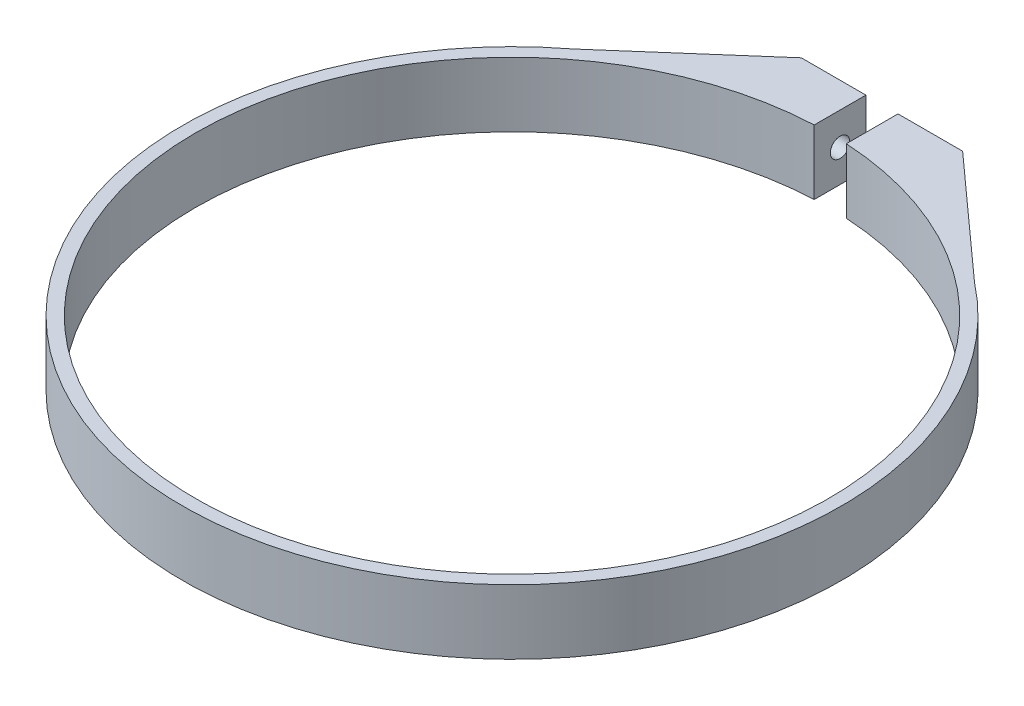
ISO-10303-21;
HEADER;
FILE_DESCRIPTION(('STEP AP214'),'2;1');
FILE_NAME('part.step','',(''),(''),'','','');
FILE_SCHEMA(('AUTOMOTIVE_DESIGN { 1 0 10303 214 1 1 1 1 }'));
ENDSEC;
DATA;
#1=APPLICATION_CONTEXT('core data for automotive mechanical design processes');
#2=APPLICATION_PROTOCOL_DEFINITION('international standard','automotive_design',2000,#1);
#3=PRODUCT_CONTEXT('',#1,'mechanical');
#4=PRODUCT('Part','Part','',(#3));
#5=PRODUCT_RELATED_PRODUCT_CATEGORY('part','',(#4));
#6=PRODUCT_DEFINITION_FORMATION('','',#4);
#7=PRODUCT_DEFINITION_CONTEXT('part definition',#1,'design');
#8=PRODUCT_DEFINITION('design','',#6,#7);
#9=PRODUCT_DEFINITION_SHAPE('','',#8);
#10=(LENGTH_UNIT() NAMED_UNIT(*) SI_UNIT(.MILLI.,.METRE.));
#11=(NAMED_UNIT(*) PLANE_ANGLE_UNIT() SI_UNIT($,.RADIAN.));
#12=(NAMED_UNIT(*) SI_UNIT($,.STERADIAN.) SOLID_ANGLE_UNIT());
#13=UNCERTAINTY_MEASURE_WITH_UNIT(LENGTH_MEASURE(1.E-05),#10,'distance_accuracy_value','');
#14=(GEOMETRIC_REPRESENTATION_CONTEXT(3) GLOBAL_UNCERTAINTY_ASSIGNED_CONTEXT((#13)) GLOBAL_UNIT_ASSIGNED_CONTEXT((#10,
#11,#12)) REPRESENTATION_CONTEXT('',''));
#15=CARTESIAN_POINT('',(0.,0.,0.));
#16=DIRECTION('',(0.,0.,1.));
#17=DIRECTION('',(1.,0.,0.));
#18=AXIS2_PLACEMENT_3D('',#15,#16,#17);
#19=CARTESIAN_POINT('',(12.817238850905,0.,-56.9189448502004));
#20=DIRECTION('',(0.,0.,-1.));
#21=DIRECTION('',(-1.,0.,0.));
#22=AXIS2_PLACEMENT_3D('',#19,#20,#21);
#23=PLANE('',#22);
#24=DIRECTION('',(-1.,0.,0.));
#25=VECTOR('',#24,1.);
#26=CARTESIAN_POINT('',(12.817238850905,10.,-56.9189448502004));
#27=LINE('',#26,#25);
#28=CARTESIAN_POINT('',(12.817238850905,10.,-56.9189448502004));
#29=VERTEX_POINT('',#28);
#30=CARTESIAN_POINT('',(2.81723885090503,10.,-56.9189448502004));
#31=VERTEX_POINT('',#30);
#32=EDGE_CURVE('E125',#29,#31,#27,.T.);
#33=ORIENTED_EDGE('',*,*,#32,.F.);
#34=DIRECTION('',(0.,1.,0.));
#35=VECTOR('',#34,1.);
#36=CARTESIAN_POINT('',(12.817238850905,0.,-56.9189448502004));
#37=LINE('',#36,#35);
#38=CARTESIAN_POINT('',(12.817238850905,0.,-56.9189448502004));
#39=VERTEX_POINT('',#38);
#40=EDGE_CURVE('E11',#39,#29,#37,.T.);
#41=ORIENTED_EDGE('',*,*,#40,.F.);
#42=DIRECTION('',(-1.,0.,0.));
#43=VECTOR('',#42,1.);
#44=CARTESIAN_POINT('',(12.817238850905,0.,-56.9189448502004));
#45=LINE('',#44,#43);
#46=CARTESIAN_POINT('',(2.81723885090503,0.,-56.9189448502004));
#47=VERTEX_POINT('',#46);
#48=EDGE_CURVE('E143',#39,#47,#45,.T.);
#49=ORIENTED_EDGE('',*,*,#48,.T.);
#50=DIRECTION('',(0.,1.,0.));
#51=VECTOR('',#50,1.);
#52=CARTESIAN_POINT('',(2.81723885090503,0.,-56.9189448502004));
#53=LINE('',#52,#51);
#54=EDGE_CURVE('E86',#47,#31,#53,.T.);
#55=ORIENTED_EDGE('',*,*,#54,.T.);
#56=EDGE_LOOP('',(#33,#41,#49,#55));
#57=FACE_BOUND('',#56,.T.);
#58=ADVANCED_FACE('F32',(#57),#23,.T.);
#59=CARTESIAN_POINT('',(31.3959204682994,0.,-40.1907474171385));
#60=DIRECTION('',(0.669127897322475,0.,-0.743147264695769));
#61=DIRECTION('',(-0.743147264695769,0.,-0.669127897322475));
#62=AXIS2_PLACEMENT_3D('',#59,#60,#61);
#63=PLANE('',#62);
#64=CARTESIAN_POINT('',(17.2237215870897,5.,-52.9513590594378));
#65=DIRECTION('',(0.669127897322475,0.,-0.743147264695769));
#66=DIRECTION('',(-0.743147264695769,0.,-0.669127897322475));
#67=AXIS2_PLACEMENT_3D('',#64,#65,#66);
#68=ELLIPSE('',#67,2.2417239006209,1.5);
#69=CARTESIAN_POINT('',(15.5577906021402,5.,-54.4513590594378));
#70=VERTEX_POINT('',#69);
#71=EDGE_CURVE('E156',#70,#70,#68,.T.);
#72=ORIENTED_EDGE('',*,*,#71,.F.);
#73=EDGE_LOOP('',(#72));
#74=FACE_BOUND('',#73,.T.);
#75=DIRECTION('',(-0.743147264695769,0.,-0.669127897322475));
#76=VECTOR('',#75,1.);
#77=CARTESIAN_POINT('',(31.3959204682994,10.,-40.1907474171385));
#78=LINE('',#77,#76);
#79=CARTESIAN_POINT('',(31.3959204682994,10.,-40.1907474171385));
#80=VERTEX_POINT('',#79);
#81=EDGE_CURVE('E141',#80,#29,#78,.T.);
#82=ORIENTED_EDGE('',*,*,#81,.F.);
#83=DIRECTION('',(0.,1.,0.));
#84=VECTOR('',#83,1.);
#85=CARTESIAN_POINT('',(31.3959204682994,0.,-40.1907474171385));
#86=LINE('',#85,#84);
#87=CARTESIAN_POINT('',(31.3959204682994,0.,-40.1907474171385));
#88=VERTEX_POINT('',#87);
#89=EDGE_CURVE('E41',#88,#80,#86,.T.);
#90=ORIENTED_EDGE('',*,*,#89,.F.);
#91=DIRECTION('',(-0.743147264695769,0.,-0.669127897322475));
#92=VECTOR('',#91,1.);
#93=CARTESIAN_POINT('',(31.3959204682994,0.,-40.1907474171385));
#94=LINE('',#93,#92);
#95=EDGE_CURVE('E115',#88,#39,#94,.T.);
#96=ORIENTED_EDGE('',*,*,#95,.T.);
#97=ORIENTED_EDGE('',*,*,#40,.T.);
#98=EDGE_LOOP('',(#82,#90,#96,#97));
#99=FACE_BOUND('',#98,.T.);
#100=ADVANCED_FACE('F197',(#74,#99),#63,.T.);
#101=CARTESIAN_POINT('',(0.,0.,0.));
#102=DIRECTION('',(0.,1.,0.));
#103=DIRECTION('',(0.,0.,1.));
#104=AXIS2_PLACEMENT_3D('',#101,#102,#103);
#105=CYLINDRICAL_SURFACE('',#104,51.);
#106=CARTESIAN_POINT('',(0.,10.,0.));
#107=DIRECTION('',(0.,1.,0.));
#108=DIRECTION('',(0.,0.,1.));
#109=AXIS2_PLACEMENT_3D('',#106,#107,#108);
#110=CIRCLE('',#109,51.);
#111=CARTESIAN_POINT('',(-31.0025901278962,10.,-40.4949306131234));
#112=VERTEX_POINT('',#111);
#113=EDGE_CURVE('E101',#112,#80,#110,.T.);
#114=ORIENTED_EDGE('',*,*,#113,.F.);
#115=DIRECTION('',(0.,1.,0.));
#116=VECTOR('',#115,1.);
#117=CARTESIAN_POINT('',(-31.0025901278962,0.,-40.4949306131234));
#118=LINE('',#117,#116);
#119=CARTESIAN_POINT('',(-31.0025901278962,0.,-40.4949306131234));
#120=VERTEX_POINT('',#119);
#121=EDGE_CURVE('E96',#120,#112,#118,.T.);
#122=ORIENTED_EDGE('',*,*,#121,.F.);
#123=CARTESIAN_POINT('',(0.,0.,0.));
#124=DIRECTION('',(0.,1.,0.));
#125=DIRECTION('',(0.,0.,1.));
#126=AXIS2_PLACEMENT_3D('',#123,#124,#125);
#127=CIRCLE('',#126,51.);
#128=EDGE_CURVE('E99',#120,#88,#127,.T.);
#129=ORIENTED_EDGE('',*,*,#128,.T.);
#130=ORIENTED_EDGE('',*,*,#89,.T.);
#131=EDGE_LOOP('',(#114,#122,#129,#130));
#132=FACE_BOUND('',#131,.T.);
#133=ADVANCED_FACE('F98',(#132),#105,.T.);
#134=CARTESIAN_POINT('',(-12.182761149095,0.,-56.9513590594378));
#135=DIRECTION('',(-0.658257137852581,0.,-0.752793159152053));
#136=DIRECTION('',(-0.752793159152053,0.,0.658257137852581));
#137=AXIS2_PLACEMENT_3D('',#134,#135,#136);
#138=PLANE('',#137);
#139=CARTESIAN_POINT('',(-16.7572237161573,5.,-52.9513590594378));
#140=DIRECTION('',(-0.658257137852581,0.,-0.752793159152053));
#141=DIRECTION('',(-0.752793159152053,0.,0.658257137852581));
#142=AXIS2_PLACEMENT_3D('',#139,#140,#141);
#143=ELLIPSE('',#142,3.79790792418248,2.5);
#144=CARTESIAN_POINT('',(-19.6162628205712,5.,-50.4513590594378));
#145=VERTEX_POINT('',#144);
#146=EDGE_CURVE('E35',#145,#145,#143,.T.);
#147=ORIENTED_EDGE('',*,*,#146,.F.);
#148=EDGE_LOOP('',(#147));
#149=FACE_BOUND('',#148,.T.);
#150=DIRECTION('',(-0.752793159152053,0.,0.658257137852581));
#151=VECTOR('',#150,1.);
#152=CARTESIAN_POINT('',(-12.182761149095,10.,-56.9513590594378));
#153=LINE('',#152,#151);
#154=CARTESIAN_POINT('',(-12.182761149095,10.,-56.9513590594378));
#155=VERTEX_POINT('',#154);
#156=EDGE_CURVE('E138',#155,#112,#153,.T.);
#157=ORIENTED_EDGE('',*,*,#156,.F.);
#158=DIRECTION('',(0.,1.,0.));
#159=VECTOR('',#158,1.);
#160=CARTESIAN_POINT('',(-12.182761149095,0.,-56.9513590594378));
#161=LINE('',#160,#159);
#162=CARTESIAN_POINT('',(-12.182761149095,0.,-56.9513590594378));
#163=VERTEX_POINT('',#162);
#164=EDGE_CURVE('E106',#163,#155,#161,.T.);
#165=ORIENTED_EDGE('',*,*,#164,.F.);
#166=DIRECTION('',(-0.752793159152053,0.,0.658257137852581));
#167=VECTOR('',#166,1.);
#168=CARTESIAN_POINT('',(-12.182761149095,0.,-56.9513590594378));
#169=LINE('',#168,#167);
#170=EDGE_CURVE('E113',#163,#120,#169,.T.);
#171=ORIENTED_EDGE('',*,*,#170,.T.);
#172=ORIENTED_EDGE('',*,*,#121,.T.);
#173=EDGE_LOOP('',(#157,#165,#171,#172));
#174=FACE_BOUND('',#173,.T.);
#175=ADVANCED_FACE('F117',(#149,#174),#138,.T.);
#176=CARTESIAN_POINT('',(-2.18276114909497,0.,-56.9513590594378));
#177=DIRECTION('',(0.,0.,-1.));
#178=DIRECTION('',(-1.,0.,0.));
#179=AXIS2_PLACEMENT_3D('',#176,#177,#178);
#180=PLANE('',#179);
#181=DIRECTION('',(-1.,0.,0.));
#182=VECTOR('',#181,1.);
#183=CARTESIAN_POINT('',(-2.18276114909497,10.,-56.9513590594378));
#184=LINE('',#183,#182);
#185=CARTESIAN_POINT('',(-2.18276114909497,10.,-56.9513590594378));
#186=VERTEX_POINT('',#185);
#187=EDGE_CURVE('E135',#186,#155,#184,.T.);
#188=ORIENTED_EDGE('',*,*,#187,.F.);
#189=DIRECTION('',(0.,1.,0.));
#190=VECTOR('',#189,1.);
#191=CARTESIAN_POINT('',(-2.18276114909497,0.,-56.9513590594378));
#192=LINE('',#191,#190);
#193=CARTESIAN_POINT('',(-2.18276114909497,0.,-56.9513590594378));
#194=VERTEX_POINT('',#193);
#195=EDGE_CURVE('E147',#194,#186,#192,.T.);
#196=ORIENTED_EDGE('',*,*,#195,.F.);
#197=DIRECTION('',(-1.,0.,0.));
#198=VECTOR('',#197,1.);
#199=CARTESIAN_POINT('',(-2.18276114909497,0.,-56.9513590594378));
#200=LINE('',#199,#198);
#201=EDGE_CURVE('E118',#194,#163,#200,.T.);
#202=ORIENTED_EDGE('',*,*,#201,.T.);
#203=ORIENTED_EDGE('',*,*,#164,.T.);
#204=EDGE_LOOP('',(#188,#196,#202,#203));
#205=FACE_BOUND('',#204,.T.);
#206=ADVANCED_FACE('F212',(#205),#180,.T.);
#207=CARTESIAN_POINT('',(-2.18276114909496,0.,-48.9513590594378));
#208=DIRECTION('',(1.,0.,0.));
#209=DIRECTION('',(0.,0.,-1.));
#210=AXIS2_PLACEMENT_3D('',#207,#208,#209);
#211=PLANE('',#210);
#212=CARTESIAN_POINT('',(-2.18276114909496,5.,-52.9513590594378));
#213=DIRECTION('',(1.,0.,0.));
#214=DIRECTION('',(0.,0.,-1.));
#215=AXIS2_PLACEMENT_3D('',#212,#213,#214);
#216=CIRCLE('',#215,1.5);
#217=CARTESIAN_POINT('',(-2.18276114909497,5.,-54.4513590594378));
#218=VERTEX_POINT('',#217);
#219=EDGE_CURVE('E161',#218,#218,#216,.T.);
#220=ORIENTED_EDGE('',*,*,#219,.F.);
#221=EDGE_LOOP('',(#220));
#222=FACE_BOUND('',#221,.T.);
#223=DIRECTION('',(0.,0.,-1.));
#224=VECTOR('',#223,1.);
#225=CARTESIAN_POINT('',(-2.18276114909496,10.,-48.9513590594378));
#226=LINE('',#225,#224);
#227=CARTESIAN_POINT('',(-2.18276114909495,10.,-48.9513590594378));
#228=VERTEX_POINT('',#227);
#229=EDGE_CURVE('E132',#228,#186,#226,.T.);
#230=ORIENTED_EDGE('',*,*,#229,.F.);
#231=DIRECTION('',(0.,1.,0.));
#232=VECTOR('',#231,1.);
#233=CARTESIAN_POINT('',(-2.18276114909495,0.,-48.9513590594378));
#234=LINE('',#233,#232);
#235=CARTESIAN_POINT('',(-2.18276114909496,0.,-48.9513590594378));
#236=VERTEX_POINT('',#235);
#237=EDGE_CURVE('E149',#236,#228,#234,.T.);
#238=ORIENTED_EDGE('',*,*,#237,.F.);
#239=DIRECTION('',(0.,0.,-1.));
#240=VECTOR('',#239,1.);
#241=CARTESIAN_POINT('',(-2.18276114909496,0.,-48.9513590594378));
#242=LINE('',#241,#240);
#243=EDGE_CURVE('E120',#236,#194,#242,.T.);
#244=ORIENTED_EDGE('',*,*,#243,.T.);
#245=ORIENTED_EDGE('',*,*,#195,.T.);
#246=EDGE_LOOP('',(#230,#238,#244,#245));
#247=FACE_BOUND('',#246,.T.);
#248=ADVANCED_FACE('F184',(#222,#247),#211,.T.);
#249=CARTESIAN_POINT('',(2.81723885090503,0.,-56.9189448502004));
#250=DIRECTION('',(-1.,0.,0.));
#251=DIRECTION('',(0.,0.,1.));
#252=AXIS2_PLACEMENT_3D('',#249,#250,#251);
#253=PLANE('',#252);
#254=CARTESIAN_POINT('',(2.81723885090503,5.,-52.9513590594378));
#255=DIRECTION('',(-1.,0.,0.));
#256=DIRECTION('',(0.,0.,1.));
#257=AXIS2_PLACEMENT_3D('',#254,#255,#256);
#258=CIRCLE('',#257,1.5);
#259=CARTESIAN_POINT('',(2.81723885090503,5.,-51.4513590594378));
#260=VERTEX_POINT('',#259);
#261=EDGE_CURVE('E154',#260,#260,#258,.T.);
#262=ORIENTED_EDGE('',*,*,#261,.F.);
#263=EDGE_LOOP('',(#262));
#264=FACE_BOUND('',#263,.T.);
#265=DIRECTION('',(0.,0.,1.));
#266=VECTOR('',#265,1.);
#267=CARTESIAN_POINT('',(2.81723885090503,10.,-56.9189448502004));
#268=LINE('',#267,#266);
#269=CARTESIAN_POINT('',(2.81723885090503,10.,-48.9189448502004));
#270=VERTEX_POINT('',#269);
#271=EDGE_CURVE('E128',#31,#270,#268,.T.);
#272=ORIENTED_EDGE('',*,*,#271,.F.);
#273=ORIENTED_EDGE('',*,*,#54,.F.);
#274=DIRECTION('',(0.,0.,1.));
#275=VECTOR('',#274,1.);
#276=CARTESIAN_POINT('',(2.81723885090503,0.,-56.9189448502004));
#277=LINE('',#276,#275);
#278=CARTESIAN_POINT('',(2.81723885090503,0.,-48.9189448502004));
#279=VERTEX_POINT('',#278);
#280=EDGE_CURVE('E179',#47,#279,#277,.T.);
#281=ORIENTED_EDGE('',*,*,#280,.T.);
#282=DIRECTION('',(0.,1.,0.));
#283=VECTOR('',#282,1.);
#284=CARTESIAN_POINT('',(2.81723885090503,0.,-48.9189448502004));
#285=LINE('',#284,#283);
#286=EDGE_CURVE('E151',#279,#270,#285,.T.);
#287=ORIENTED_EDGE('',*,*,#286,.T.);
#288=EDGE_LOOP('',(#272,#273,#281,#287));
#289=FACE_BOUND('',#288,.T.);
#290=ADVANCED_FACE('F195',(#264,#289),#253,.T.);
#291=CARTESIAN_POINT('',(0.,0.,0.));
#292=DIRECTION('',(0.,1.,0.));
#293=DIRECTION('',(0.,0.,1.));
#294=AXIS2_PLACEMENT_3D('',#291,#292,#293);
#295=PLANE('',#294);
#296=ORIENTED_EDGE('',*,*,#243,.F.);
#297=CARTESIAN_POINT('',(0.,0.,0.));
#298=DIRECTION('',(0.,-1.,0.));
#299=DIRECTION('',(0.,0.,-1.));
#300=AXIS2_PLACEMENT_3D('',#297,#298,#299);
#301=CIRCLE('',#300,49.);
#302=EDGE_CURVE('E173',#279,#236,#301,.T.);
#303=ORIENTED_EDGE('',*,*,#302,.F.);
#304=ORIENTED_EDGE('',*,*,#280,.F.);
#305=ORIENTED_EDGE('',*,*,#48,.F.);
#306=ORIENTED_EDGE('',*,*,#95,.F.);
#307=ORIENTED_EDGE('',*,*,#128,.F.);
#308=ORIENTED_EDGE('',*,*,#170,.F.);
#309=ORIENTED_EDGE('',*,*,#201,.F.);
#310=EDGE_LOOP('',(#296,#303,#304,#305,#306,#307,#308,#309));
#311=FACE_BOUND('',#310,.T.);
#312=ADVANCED_FACE('F111',(#311),#295,.F.);
#313=CARTESIAN_POINT('',(0.,10.,0.));
#314=DIRECTION('',(0.,1.,0.));
#315=DIRECTION('',(0.,0.,1.));
#316=AXIS2_PLACEMENT_3D('',#313,#314,#315);
#317=PLANE('',#316);
#318=CARTESIAN_POINT('',(0.,10.,0.));
#319=DIRECTION('',(0.,-1.,0.));
#320=DIRECTION('',(0.,0.,-1.));
#321=AXIS2_PLACEMENT_3D('',#318,#319,#320);
#322=CIRCLE('',#321,49.);
#323=EDGE_CURVE('E129',#270,#228,#322,.T.);
#324=ORIENTED_EDGE('',*,*,#323,.T.);
#325=ORIENTED_EDGE('',*,*,#229,.T.);
#326=ORIENTED_EDGE('',*,*,#187,.T.);
#327=ORIENTED_EDGE('',*,*,#156,.T.);
#328=ORIENTED_EDGE('',*,*,#113,.T.);
#329=ORIENTED_EDGE('',*,*,#81,.T.);
#330=ORIENTED_EDGE('',*,*,#32,.T.);
#331=ORIENTED_EDGE('',*,*,#271,.T.);
#332=EDGE_LOOP('',(#324,#325,#326,#327,#328,#329,#330,#331));
#333=FACE_BOUND('',#332,.T.);
#334=ADVANCED_FACE('F196',(#333),#317,.T.);
#335=CARTESIAN_POINT('',(0.,10.,0.));
#336=DIRECTION('',(0.,-1.,0.));
#337=DIRECTION('',(0.,0.,-1.));
#338=AXIS2_PLACEMENT_3D('',#335,#336,#337);
#339=CYLINDRICAL_SURFACE('',#338,49.);
#340=ORIENTED_EDGE('',*,*,#237,.T.);
#341=ORIENTED_EDGE('',*,*,#323,.F.);
#342=ORIENTED_EDGE('',*,*,#286,.F.);
#343=ORIENTED_EDGE('',*,*,#302,.T.);
#344=EDGE_LOOP('',(#340,#341,#342,#343));
#345=FACE_BOUND('',#344,.T.);
#346=ADVANCED_FACE('F193',(#345),#339,.F.);
#347=CARTESIAN_POINT('',(-19.6162628205712,5.,-52.9513590594378));
#348=DIRECTION('',(-1.,0.,0.));
#349=DIRECTION('',(0.,0.,1.));
#350=AXIS2_PLACEMENT_3D('',#347,#348,#349);
#351=CYLINDRICAL_SURFACE('',#350,1.5);
#352=ORIENTED_EDGE('',*,*,#71,.T.);
#353=EDGE_LOOP('',(#352));
#354=FACE_BOUND('',#353,.T.);
#355=ORIENTED_EDGE('',*,*,#261,.T.);
#356=EDGE_LOOP('',(#355));
#357=FACE_BOUND('',#356,.T.);
#358=ADVANCED_FACE('F230',(#354,#357),#351,.F.);
#359=ORIENTED_EDGE('',*,*,#219,.T.);
#360=EDGE_LOOP('',(#359));
#361=FACE_BOUND('',#360,.T.);
#362=CARTESIAN_POINT('',(-7.18276114909497,5.,-52.9513590594378));
#363=DIRECTION('',(-1.,0.,0.));
#364=DIRECTION('',(0.,0.,1.));
#365=AXIS2_PLACEMENT_3D('',#362,#363,#364);
#366=CIRCLE('',#365,1.50000000000001);
#367=CARTESIAN_POINT('',(-7.18276114909497,5.,-51.4513590594378));
#368=VERTEX_POINT('',#367);
#369=EDGE_CURVE('E157',#368,#368,#366,.T.);
#370=ORIENTED_EDGE('',*,*,#369,.T.);
#371=EDGE_LOOP('',(#370));
#372=FACE_BOUND('',#371,.T.);
#373=ADVANCED_FACE('F233',(#361,#372),#351,.F.);
#374=CARTESIAN_POINT('',(-7.18276114909497,6.50000000000001,-52.9513590594378));
#375=DIRECTION('',(1.,0.,0.));
#376=DIRECTION('',(0.,0.,-1.));
#377=AXIS2_PLACEMENT_3D('',#374,#375,#376);
#378=PLANE('',#377);
#379=ORIENTED_EDGE('',*,*,#369,.F.);
#380=EDGE_LOOP('',(#379));
#381=FACE_BOUND('',#380,.T.);
#382=CARTESIAN_POINT('',(-7.18276114909497,5.,-52.9513590594378));
#383=DIRECTION('',(-1.,0.,0.));
#384=DIRECTION('',(0.,0.,1.));
#385=AXIS2_PLACEMENT_3D('',#382,#383,#384);
#386=CIRCLE('',#385,2.5);
#387=CARTESIAN_POINT('',(-7.18276114909497,5.,-50.4513590594378));
#388=VERTEX_POINT('',#387);
#389=EDGE_CURVE('E164',#388,#388,#386,.T.);
#390=ORIENTED_EDGE('',*,*,#389,.T.);
#391=EDGE_LOOP('',(#390));
#392=FACE_BOUND('',#391,.T.);
#393=ADVANCED_FACE('F235',(#381,#392),#378,.F.);
#394=CARTESIAN_POINT('',(-19.6162628205712,5.,-52.9513590594378));
#395=DIRECTION('',(-1.,0.,0.));
#396=DIRECTION('',(0.,0.,1.));
#397=AXIS2_PLACEMENT_3D('',#394,#395,#396);
#398=CYLINDRICAL_SURFACE('',#397,2.5);
#399=ORIENTED_EDGE('',*,*,#146,.T.);
#400=EDGE_LOOP('',(#399));
#401=FACE_BOUND('',#400,.T.);
#402=ORIENTED_EDGE('',*,*,#389,.F.);
#403=EDGE_LOOP('',(#402));
#404=FACE_BOUND('',#403,.T.);
#405=ADVANCED_FACE('F238',(#401,#404),#398,.F.);
#406=CLOSED_SHELL('',(#58,#100,#133,#175,#206,#248,#290,#312,#334,#346,#358,#373,#393,#405));
#407=MANIFOLD_SOLID_BREP('B2',#406);
#408=ADVANCED_BREP_SHAPE_REPRESENTATION('',(#18,#407),#14);
#409=SHAPE_DEFINITION_REPRESENTATION(#9,#408);
ENDSEC;
END-ISO-10303-21;
